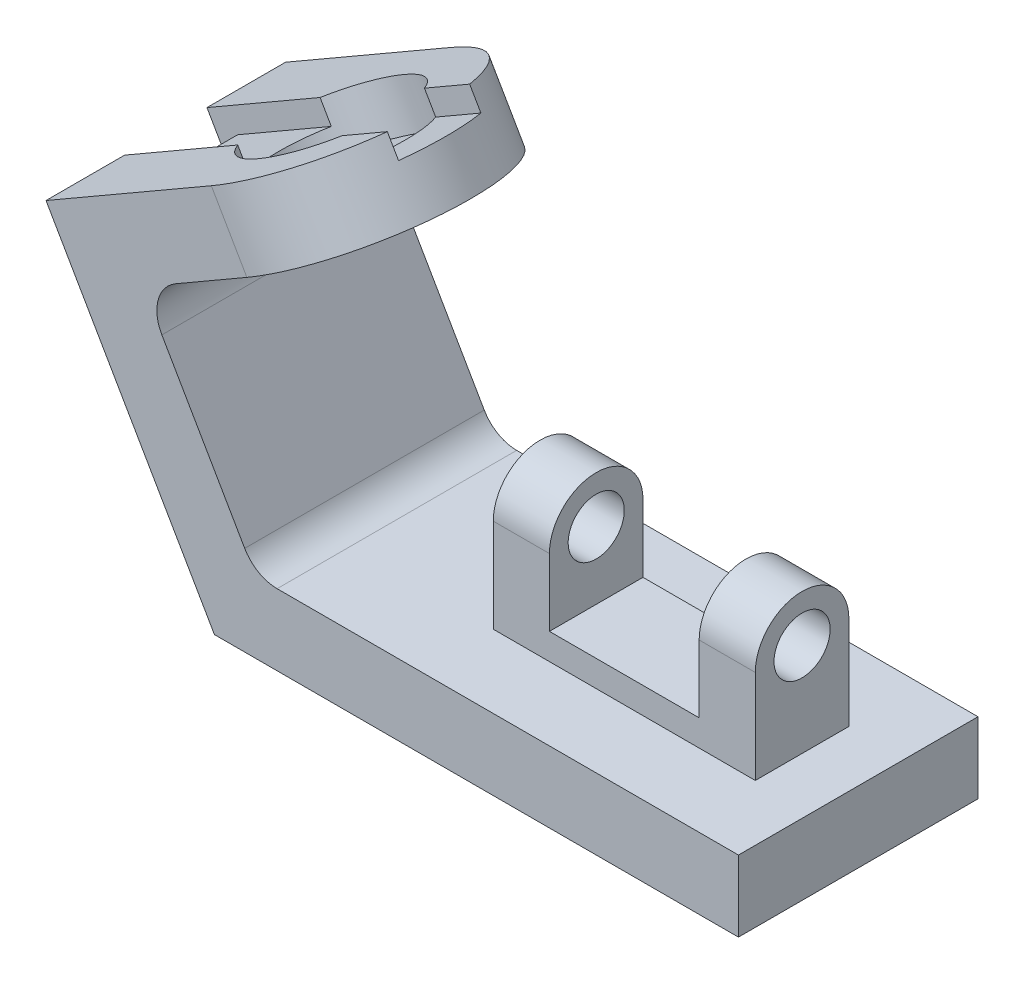
ISO-10303-21;
HEADER;
FILE_DESCRIPTION(('STEP AP214'),'2;1');
FILE_NAME('part.step','',(''),(''),'','','');
FILE_SCHEMA(('AUTOMOTIVE_DESIGN { 1 0 10303 214 1 1 1 1 }'));
ENDSEC;
DATA;
#1=APPLICATION_CONTEXT('core data for automotive mechanical design processes');
#2=APPLICATION_PROTOCOL_DEFINITION('international standard','automotive_design',2000,#1);
#3=PRODUCT_CONTEXT('',#1,'mechanical');
#4=PRODUCT('Part','Part','',(#3));
#5=PRODUCT_RELATED_PRODUCT_CATEGORY('part','',(#4));
#6=PRODUCT_DEFINITION_FORMATION('','',#4);
#7=PRODUCT_DEFINITION_CONTEXT('part definition',#1,'design');
#8=PRODUCT_DEFINITION('design','',#6,#7);
#9=PRODUCT_DEFINITION_SHAPE('','',#8);
#10=(LENGTH_UNIT() NAMED_UNIT(*) SI_UNIT(.MILLI.,.METRE.));
#11=(NAMED_UNIT(*) PLANE_ANGLE_UNIT() SI_UNIT($,.RADIAN.));
#12=(NAMED_UNIT(*) SI_UNIT($,.STERADIAN.) SOLID_ANGLE_UNIT());
#13=UNCERTAINTY_MEASURE_WITH_UNIT(LENGTH_MEASURE(1.E-05),#10,'distance_accuracy_value','');
#14=(GEOMETRIC_REPRESENTATION_CONTEXT(3) GLOBAL_UNCERTAINTY_ASSIGNED_CONTEXT((#13)) GLOBAL_UNIT_ASSIGNED_CONTEXT((#10,
#11,#12)) REPRESENTATION_CONTEXT('',''));
#15=CARTESIAN_POINT('',(0.,0.,0.));
#16=DIRECTION('',(0.,0.,1.));
#17=DIRECTION('',(1.,0.,0.));
#18=AXIS2_PLACEMENT_3D('',#15,#16,#17);
#19=CARTESIAN_POINT('',(55.,44.,-32.));
#20=DIRECTION('',(1.,0.,0.));
#21=DIRECTION('',(0.,0.,-1.));
#22=AXIS2_PLACEMENT_3D('',#19,#20,#21);
#23=CYLINDRICAL_SURFACE('',#22,12.5);
#24=CARTESIAN_POINT('',(70.,44.,-32.));
#25=DIRECTION('',(-1.,0.,0.));
#26=DIRECTION('',(0.,0.,1.));
#27=AXIS2_PLACEMENT_3D('',#24,#25,#26);
#28=CIRCLE('',#27,12.5);
#29=CARTESIAN_POINT('',(70.,44.,-44.5));
#30=VERTEX_POINT('',#29);
#31=CARTESIAN_POINT('',(70.,44.,-19.5));
#32=VERTEX_POINT('',#31);
#33=EDGE_CURVE('E235',#30,#32,#28,.F.);
#34=ORIENTED_EDGE('',*,*,#33,.F.);
#35=DIRECTION('',(1.,0.,0.));
#36=VECTOR('',#35,1.);
#37=CARTESIAN_POINT('',(55.,44.,-44.5));
#38=LINE('',#37,#36);
#39=CARTESIAN_POINT('',(55.,44.,-44.5));
#40=VERTEX_POINT('',#39);
#41=EDGE_CURVE('E309',#40,#30,#38,.T.);
#42=ORIENTED_EDGE('',*,*,#41,.F.);
#43=CARTESIAN_POINT('',(55.,44.,-32.));
#44=DIRECTION('',(1.,0.,0.));
#45=DIRECTION('',(0.,0.,1.));
#46=AXIS2_PLACEMENT_3D('',#43,#44,#45);
#47=CIRCLE('',#46,12.5);
#48=CARTESIAN_POINT('',(55.,44.,-19.5));
#49=VERTEX_POINT('',#48);
#50=EDGE_CURVE('E278',#40,#49,#47,.T.);
#51=ORIENTED_EDGE('',*,*,#50,.T.);
#52=DIRECTION('',(1.,0.,0.));
#53=VECTOR('',#52,1.);
#54=CARTESIAN_POINT('',(55.,44.,-19.5));
#55=LINE('',#54,#53);
#56=EDGE_CURVE('E305',#49,#32,#55,.T.);
#57=ORIENTED_EDGE('',*,*,#56,.T.);
#58=EDGE_LOOP('',(#34,#42,#51,#57));
#59=FACE_BOUND('',#58,.T.);
#60=ADVANCED_FACE('F43',(#59),#23,.T.);
#61=CARTESIAN_POINT('',(2.16729559300655,98.2461339178928,-32.));
#62=DIRECTION('',(-0.499999999999998,0.86602540378444,0.));
#63=DIRECTION('',(-0.86602540378444,-0.499999999999998,0.));
#64=AXIS2_PLACEMENT_3D('',#61,#62,#63);
#65=PLANE('',#64);
#66=DIRECTION('',(-0.86602540378444,-0.499999999999998,0.));
#67=VECTOR('',#66,1.);
#68=CARTESIAN_POINT('',(-41.9999999999999,72.746133917893,-43.));
#69=LINE('',#68,#67);
#70=CARTESIAN_POINT('',(-11.7767891743778,90.1955128238406,-43.));
#71=VERTEX_POINT('',#70);
#72=CARTESIAN_POINT('',(-36.8038475772932,75.7461339178929,-43.));
#73=VERTEX_POINT('',#72);
#74=EDGE_CURVE('E367',#71,#73,#69,.T.);
#75=ORIENTED_EDGE('',*,*,#74,.T.);
#76=DIRECTION('',(0.,0.,1.));
#77=VECTOR('',#76,1.);
#78=CARTESIAN_POINT('',(-36.8038475772932,75.7461339178929,-32.));
#79=LINE('',#78,#77);
#80=CARTESIAN_POINT('',(-36.8038475772932,75.7461339178929,-21.));
#81=VERTEX_POINT('',#80);
#82=EDGE_CURVE('E335',#73,#81,#79,.T.);
#83=ORIENTED_EDGE('',*,*,#82,.T.);
#84=DIRECTION('',(0.86602540378444,0.499999999999998,0.));
#85=VECTOR('',#84,1.);
#86=CARTESIAN_POINT('',(-41.9999999999999,72.746133917893,-21.));
#87=LINE('',#86,#85);
#88=CARTESIAN_POINT('',(-11.7767891743778,90.1955128238406,-21.));
#89=VERTEX_POINT('',#88);
#90=EDGE_CURVE('E374',#81,#89,#87,.T.);
#91=ORIENTED_EDGE('',*,*,#90,.T.);
#92=CARTESIAN_POINT('',(2.16729559300654,98.2461339178928,-32.));
#93=DIRECTION('',(-0.499999999999998,0.86602540378444,0.));
#94=DIRECTION('',(-0.86602540378444,-0.499999999999998,0.));
#95=AXIS2_PLACEMENT_3D('',#92,#93,#94);
#96=CIRCLE('',#95,19.5);
#97=EDGE_CURVE('E354',#71,#89,#96,.T.);
#98=ORIENTED_EDGE('',*,*,#97,.F.);
#99=EDGE_LOOP('',(#75,#83,#91,#98));
#100=FACE_BOUND('',#99,.T.);
#101=ADVANCED_FACE('F613',(#100),#65,.T.);
#102=CARTESIAN_POINT('',(79.167978605708,-35.1229612776126,-32.));
#103=DIRECTION('',(-0.499999999999998,0.86602540378444,0.));
#104=DIRECTION('',(-0.86602540378444,-0.499999999999998,0.));
#105=AXIS2_PLACEMENT_3D('',#102,#103,#104);
#106=CYLINDRICAL_SURFACE('',#105,9.5);
#107=CARTESIAN_POINT('',(8.66729559300654,86.9878036686951,-32.));
#108=DIRECTION('',(0.499999999999998,-0.86602540378444,0.));
#109=DIRECTION('',(0.86602540378444,0.499999999999998,0.));
#110=AXIS2_PLACEMENT_3D('',#107,#108,#109);
#111=CIRCLE('',#110,9.5);
#112=CARTESIAN_POINT('',(16.8945369289587,91.7378036686951,-32.));
#113=VERTEX_POINT('',#112);
#114=EDGE_CURVE('E390',#113,#113,#111,.F.);
#115=ORIENTED_EDGE('',*,*,#114,.F.);
#116=EDGE_LOOP('',(#115));
#117=FACE_BOUND('',#116,.T.);
#118=CARTESIAN_POINT('',(5.16729559300652,93.0499814951862,-32.));
#119=DIRECTION('',(-0.499999999999998,0.86602540378444,0.));
#120=DIRECTION('',(-0.86602540378444,-0.499999999999998,0.));
#121=AXIS2_PLACEMENT_3D('',#118,#119,#120);
#122=CIRCLE('',#121,9.5);
#123=CARTESIAN_POINT('',(-3.05994574294566,88.2999814951863,-32.));
#124=VERTEX_POINT('',#123);
#125=EDGE_CURVE('E362',#124,#124,#122,.F.);
#126=ORIENTED_EDGE('',*,*,#125,.F.);
#127=EDGE_LOOP('',(#126));
#128=FACE_BOUND('',#127,.T.);
#129=ADVANCED_FACE('F618',(#117,#128),#106,.F.);
#130=CARTESIAN_POINT('',(16.1113803603909,106.296755011945,-21.));
#131=VERTEX_POINT('',#130);
#132=CARTESIAN_POINT('',(16.1113803603909,106.296755011945,-43.));
#133=VERTEX_POINT('',#132);
#134=EDGE_CURVE('E347',#131,#133,#96,.T.);
#135=ORIENTED_EDGE('',*,*,#134,.F.);
#136=CARTESIAN_POINT('',(28.1913229523528,113.27111311921,-21.));
#137=VERTEX_POINT('',#136);
#138=EDGE_CURVE('E373',#131,#137,#87,.T.);
#139=ORIENTED_EDGE('',*,*,#138,.T.);
#140=CARTESIAN_POINT('',(2.16729559300655,98.2461339178928,-32.));
#141=DIRECTION('',(-0.499999999999998,0.86602540378444,0.));
#142=DIRECTION('',(-0.86602540378444,-0.499999999999998,0.));
#143=AXIS2_PLACEMENT_3D('',#140,#141,#142);
#144=CIRCLE('',#143,32.);
#145=CARTESIAN_POINT('',(28.1913229523528,113.27111311921,-43.));
#146=VERTEX_POINT('',#145);
#147=EDGE_CURVE('E363',#137,#146,#144,.T.);
#148=ORIENTED_EDGE('',*,*,#147,.T.);
#149=EDGE_CURVE('E369',#146,#133,#69,.T.);
#150=ORIENTED_EDGE('',*,*,#149,.T.);
#151=EDGE_LOOP('',(#135,#139,#148,#150));
#152=FACE_BOUND('',#151,.T.);
#153=ADVANCED_FACE('F621',(#152),#65,.T.);
#154=CARTESIAN_POINT('',(-41.9999999999999,72.746133917893,-21.));
#155=DIRECTION('',(0.,0.,1.));
#156=DIRECTION('',(1.,0.,0.));
#157=AXIS2_PLACEMENT_3D('',#154,#155,#156);
#158=PLANE('',#157);
#159=ORIENTED_EDGE('',*,*,#138,.F.);
#160=DIRECTION('',(-0.499999999999998,0.86602540378444,0.));
#161=VECTOR('',#160,1.);
#162=CARTESIAN_POINT('',(19.1113803603909,101.100602589238,-21.));
#163=LINE('',#162,#161);
#164=CARTESIAN_POINT('',(13.1113803603909,111.492907434652,-21.));
#165=VERTEX_POINT('',#164);
#166=EDGE_CURVE('E353',#131,#165,#163,.T.);
#167=ORIENTED_EDGE('',*,*,#166,.T.);
#168=DIRECTION('',(0.86602540378444,0.499999999999998,0.));
#169=VECTOR('',#168,1.);
#170=CARTESIAN_POINT('',(-44.9999999999998,77.9422863405996,-21.));
#171=LINE('',#170,#169);
#172=CARTESIAN_POINT('',(25.1913229523528,118.467265541916,-21.));
#173=VERTEX_POINT('',#172);
#174=EDGE_CURVE('E382',#165,#173,#171,.T.);
#175=ORIENTED_EDGE('',*,*,#174,.T.);
#176=DIRECTION('',(-0.499999999999998,0.86602540378444,0.));
#177=VECTOR('',#176,1.);
#178=CARTESIAN_POINT('',(28.1913229523528,113.27111311921,-21.));
#179=LINE('',#178,#177);
#180=EDGE_CURVE('E386',#137,#173,#179,.T.);
#181=ORIENTED_EDGE('',*,*,#180,.F.);
#182=EDGE_LOOP('',(#159,#167,#175,#181));
#183=FACE_BOUND('',#182,.T.);
#184=ADVANCED_FACE('F716',(#183),#158,.F.);
#185=CARTESIAN_POINT('',(-41.9999999999999,72.746133917893,-43.));
#186=DIRECTION('',(0.,0.,-1.));
#187=DIRECTION('',(-1.,0.,0.));
#188=AXIS2_PLACEMENT_3D('',#185,#186,#187);
#189=PLANE('',#188);
#190=DIRECTION('',(-0.499999999999998,0.86602540378444,0.));
#191=VECTOR('',#190,1.);
#192=CARTESIAN_POINT('',(-41.9999999999999,72.746133917893,-43.));
#193=LINE('',#192,#191);
#194=CARTESIAN_POINT('',(-17.,29.444863728671,-43.));
#195=VERTEX_POINT('',#194);
#196=CARTESIAN_POINT('',(-44.9999999999998,77.9422863405996,-43.));
#197=VERTEX_POINT('',#196);
#198=EDGE_CURVE('E394',#195,#197,#193,.T.);
#199=ORIENTED_EDGE('',*,*,#198,.F.);
#200=DIRECTION('',(-0.86602540378444,-0.499999999999998,0.));
#201=VECTOR('',#200,1.);
#202=CARTESIAN_POINT('',(-11.8038475772933,32.444863728671,-43.));
#203=LINE('',#202,#201);
#204=CARTESIAN_POINT('',(-11.8038475772933,32.444863728671,-43.));
#205=VERTEX_POINT('',#204);
#206=EDGE_CURVE('E327',#205,#195,#203,.T.);
#207=ORIENTED_EDGE('',*,*,#206,.F.);
#208=DIRECTION('',(0.499999999999998,-0.86602540378444,0.));
#209=VECTOR('',#208,1.);
#210=CARTESIAN_POINT('',(-39.8038475772932,80.9422863405996,-43.));
#211=LINE('',#210,#209);
#212=EDGE_CURVE('E320',#73,#205,#211,.T.);
#213=ORIENTED_EDGE('',*,*,#212,.F.);
#214=ORIENTED_EDGE('',*,*,#74,.F.);
#215=DIRECTION('',(-0.499999999999998,0.86602540378444,0.));
#216=VECTOR('',#215,1.);
#217=CARTESIAN_POINT('',(-8.77678917437782,84.9993604011339,-43.));
#218=LINE('',#217,#216);
#219=CARTESIAN_POINT('',(-14.7767891743778,95.3916652465472,-43.));
#220=VERTEX_POINT('',#219);
#221=EDGE_CURVE('E491',#71,#220,#218,.T.);
#222=ORIENTED_EDGE('',*,*,#221,.T.);
#223=DIRECTION('',(-0.86602540378444,-0.499999999999998,0.));
#224=VECTOR('',#223,1.);
#225=CARTESIAN_POINT('',(-44.9999999999998,77.9422863405996,-43.));
#226=LINE('',#225,#224);
#227=EDGE_CURVE('E383',#220,#197,#226,.T.);
#228=ORIENTED_EDGE('',*,*,#227,.T.);
#229=EDGE_LOOP('',(#199,#207,#213,#214,#222,#228));
#230=FACE_BOUND('',#229,.T.);
#231=ADVANCED_FACE('F713',(#230),#189,.F.);
#232=CARTESIAN_POINT('',(-44.9999999999998,77.9422863405996,-64.));
#233=DIRECTION('',(-0.499999999999998,0.86602540378444,0.));
#234=DIRECTION('',(-0.86602540378444,-0.499999999999998,0.));
#235=AXIS2_PLACEMENT_3D('',#232,#233,#234);
#236=PLANE('',#235);
#237=CARTESIAN_POINT('',(-0.832704406993449,103.442286340599,-32.));
#238=DIRECTION('',(-0.499999999999998,0.86602540378444,0.));
#239=DIRECTION('',(-0.86602540378444,-0.499999999999998,0.));
#240=AXIS2_PLACEMENT_3D('',#237,#238,#239);
#241=CIRCLE('',#240,19.5);
#242=CARTESIAN_POINT('',(-14.7767891743778,95.3916652465472,-21.));
#243=VERTEX_POINT('',#242);
#244=EDGE_CURVE('E348',#243,#165,#241,.T.);
#245=ORIENTED_EDGE('',*,*,#244,.F.);
#246=CARTESIAN_POINT('',(-44.9999999999998,77.9422863405996,-21.));
#247=VERTEX_POINT('',#246);
#248=EDGE_CURVE('E368',#247,#243,#171,.T.);
#249=ORIENTED_EDGE('',*,*,#248,.F.);
#250=DIRECTION('',(0.,0.,1.));
#251=VECTOR('',#250,1.);
#252=CARTESIAN_POINT('',(-44.9999999999998,77.9422863405996,-64.));
#253=LINE('',#252,#251);
#254=CARTESIAN_POINT('',(-44.9999999999998,77.9422863405996,0.));
#255=VERTEX_POINT('',#254);
#256=EDGE_CURVE('E482',#247,#255,#253,.T.);
#257=ORIENTED_EDGE('',*,*,#256,.T.);
#258=DIRECTION('',(-0.86602540378444,-0.499999999999998,0.));
#259=VECTOR('',#258,1.);
#260=CARTESIAN_POINT('',(-44.9999999999998,77.9422863405996,0.));
#261=LINE('',#260,#259);
#262=CARTESIAN_POINT('',(-0.832704406993401,103.442286340599,0.));
#263=VERTEX_POINT('',#262);
#264=EDGE_CURVE('E467',#263,#255,#261,.T.);
#265=ORIENTED_EDGE('',*,*,#264,.F.);
#266=CARTESIAN_POINT('',(-0.832704406993429,103.442286340599,-32.));
#267=DIRECTION('',(-0.499999999999998,0.86602540378444,0.));
#268=DIRECTION('',(0.86602540378444,0.499999999999998,0.));
#269=AXIS2_PLACEMENT_3D('',#266,#267,#268);
#270=CIRCLE('',#269,32.);
#271=EDGE_CURVE('E409',#263,#173,#270,.T.);
#272=ORIENTED_EDGE('',*,*,#271,.T.);
#273=ORIENTED_EDGE('',*,*,#174,.F.);
#274=EDGE_LOOP('',(#245,#249,#257,#265,#272,#273));
#275=FACE_BOUND('',#274,.T.);
#276=ADVANCED_FACE('F684',(#275),#236,.T.);
#277=CARTESIAN_POINT('',(140.,0.,-64.));
#278=DIRECTION('',(0.,-1.,0.));
#279=DIRECTION('',(0.,0.,-1.));
#280=AXIS2_PLACEMENT_3D('',#277,#278,#279);
#281=PLANE('',#280);
#282=DIRECTION('',(1.,0.,0.));
#283=VECTOR('',#282,1.);
#284=CARTESIAN_POINT('',(140.,0.,0.));
#285=LINE('',#284,#283);
#286=CARTESIAN_POINT('',(0.,0.,0.));
#287=VERTEX_POINT('',#286);
#288=CARTESIAN_POINT('',(140.,0.,0.));
#289=VERTEX_POINT('',#288);
#290=EDGE_CURVE('E408',#287,#289,#285,.T.);
#291=ORIENTED_EDGE('',*,*,#290,.F.);
#292=DIRECTION('',(0.,0.,1.));
#293=VECTOR('',#292,1.);
#294=CARTESIAN_POINT('',(0.,0.,-64.));
#295=LINE('',#294,#293);
#296=CARTESIAN_POINT('',(0.,0.,-64.));
#297=VERTEX_POINT('',#296);
#298=EDGE_CURVE('E474',#297,#287,#295,.T.);
#299=ORIENTED_EDGE('',*,*,#298,.F.);
#300=DIRECTION('',(1.,0.,0.));
#301=VECTOR('',#300,1.);
#302=CARTESIAN_POINT('',(140.,0.,-64.));
#303=LINE('',#302,#301);
#304=CARTESIAN_POINT('',(140.,0.,-64.));
#305=VERTEX_POINT('',#304);
#306=EDGE_CURVE('E413',#297,#305,#303,.T.);
#307=ORIENTED_EDGE('',*,*,#306,.T.);
#308=DIRECTION('',(0.,0.,1.));
#309=VECTOR('',#308,1.);
#310=CARTESIAN_POINT('',(140.,0.,-64.));
#311=LINE('',#310,#309);
#312=EDGE_CURVE('E444',#305,#289,#311,.T.);
#313=ORIENTED_EDGE('',*,*,#312,.T.);
#314=EDGE_LOOP('',(#291,#299,#307,#313));
#315=FACE_BOUND('',#314,.T.);
#316=ADVANCED_FACE('F549',(#315),#281,.T.);
#317=CARTESIAN_POINT('',(0.,0.,-64.));
#318=DIRECTION('',(-0.86602540378444,-0.499999999999998,0.));
#319=DIRECTION('',(0.499999999999998,-0.86602540378444,0.));
#320=AXIS2_PLACEMENT_3D('',#317,#318,#319);
#321=PLANE('',#320);
#322=DIRECTION('',(-0.499999999999998,0.86602540378444,0.));
#323=VECTOR('',#322,1.);
#324=CARTESIAN_POINT('',(-41.9999999999999,72.746133917893,-21.));
#325=LINE('',#324,#323);
#326=CARTESIAN_POINT('',(-17.,29.444863728671,-21.));
#327=VERTEX_POINT('',#326);
#328=EDGE_CURVE('E391',#327,#247,#325,.T.);
#329=ORIENTED_EDGE('',*,*,#328,.F.);
#330=DIRECTION('',(0.,0.,1.));
#331=VECTOR('',#330,1.);
#332=CARTESIAN_POINT('',(-17.,29.444863728671,-43.));
#333=LINE('',#332,#331);
#334=EDGE_CURVE('E304',#195,#327,#333,.T.);
#335=ORIENTED_EDGE('',*,*,#334,.F.);
#336=ORIENTED_EDGE('',*,*,#198,.T.);
#337=CARTESIAN_POINT('',(-44.9999999999998,77.9422863405996,-64.));
#338=VERTEX_POINT('',#337);
#339=EDGE_CURVE('E478',#338,#197,#253,.T.);
#340=ORIENTED_EDGE('',*,*,#339,.F.);
#341=DIRECTION('',(0.499999999999998,-0.86602540378444,0.));
#342=VECTOR('',#341,1.);
#343=CARTESIAN_POINT('',(0.,0.,-64.));
#344=LINE('',#343,#342);
#345=EDGE_CURVE('E440',#338,#297,#344,.T.);
#346=ORIENTED_EDGE('',*,*,#345,.T.);
#347=ORIENTED_EDGE('',*,*,#298,.T.);
#348=DIRECTION('',(0.499999999999998,-0.86602540378444,0.));
#349=VECTOR('',#348,1.);
#350=CARTESIAN_POINT('',(0.,0.,0.));
#351=LINE('',#350,#349);
#352=EDGE_CURVE('E418',#255,#287,#351,.T.);
#353=ORIENTED_EDGE('',*,*,#352,.F.);
#354=ORIENTED_EDGE('',*,*,#256,.F.);
#355=EDGE_LOOP('',(#329,#335,#336,#340,#346,#347,#353,#354));
#356=FACE_BOUND('',#355,.T.);
#357=ADVANCED_FACE('F553',(#356),#321,.T.);
#358=CARTESIAN_POINT('',(13.1113803603909,111.492907434652,-43.));
#359=VERTEX_POINT('',#358);
#360=EDGE_CURVE('E342',#359,#220,#241,.T.);
#361=ORIENTED_EDGE('',*,*,#360,.F.);
#362=CARTESIAN_POINT('',(25.1913229523528,118.467265541916,-43.));
#363=VERTEX_POINT('',#362);
#364=EDGE_CURVE('E378',#363,#359,#226,.T.);
#365=ORIENTED_EDGE('',*,*,#364,.F.);
#366=CARTESIAN_POINT('',(-0.832704406993429,103.442286340599,-64.));
#367=VERTEX_POINT('',#366);
#368=EDGE_CURVE('E403',#363,#367,#270,.T.);
#369=ORIENTED_EDGE('',*,*,#368,.T.);
#370=DIRECTION('',(-0.86602540378444,-0.499999999999998,0.));
#371=VECTOR('',#370,1.);
#372=CARTESIAN_POINT('',(-44.9999999999998,77.9422863405996,-64.));
#373=LINE('',#372,#371);
#374=EDGE_CURVE('E436',#367,#338,#373,.T.);
#375=ORIENTED_EDGE('',*,*,#374,.T.);
#376=ORIENTED_EDGE('',*,*,#339,.T.);
#377=ORIENTED_EDGE('',*,*,#227,.F.);
#378=EDGE_LOOP('',(#361,#365,#369,#375,#376,#377));
#379=FACE_BOUND('',#378,.T.);
#380=ADVANCED_FACE('F559',(#379),#236,.T.);
#381=CARTESIAN_POINT('',(8.66729559300655,86.9878036686951,-64.));
#382=DIRECTION('',(0.499999999999998,-0.86602540378444,0.));
#383=DIRECTION('',(0.86602540378444,0.499999999999998,0.));
#384=AXIS2_PLACEMENT_3D('',#381,#382,#383);
#385=PLANE('',#384);
#386=ORIENTED_EDGE('',*,*,#114,.T.);
#387=EDGE_LOOP('',(#386));
#388=FACE_BOUND('',#387,.T.);
#389=DIRECTION('',(0.86602540378444,0.499999999999998,0.));
#390=VECTOR('',#389,1.);
#391=CARTESIAN_POINT('',(8.66729559300655,86.9878036686951,0.));
#392=LINE('',#391,#390);
#393=CARTESIAN_POINT('',(-10.3852632902511,75.9878036686952,0.));
#394=VERTEX_POINT('',#393);
#395=CARTESIAN_POINT('',(8.66729559300654,86.9878036686952,0.));
#396=VERTEX_POINT('',#395);
#397=EDGE_CURVE('E460',#394,#396,#392,.T.);
#398=ORIENTED_EDGE('',*,*,#397,.F.);
#399=DIRECTION('',(0.,0.,1.));
#400=VECTOR('',#399,1.);
#401=CARTESIAN_POINT('',(-10.3852632902511,75.9878036686952,-64.));
#402=LINE('',#401,#400);
#403=CARTESIAN_POINT('',(-10.3852632902511,75.9878036686952,-64.));
#404=VERTEX_POINT('',#403);
#405=EDGE_CURVE('E520',#394,#404,#402,.F.);
#406=ORIENTED_EDGE('',*,*,#405,.T.);
#407=DIRECTION('',(0.86602540378444,0.499999999999998,0.));
#408=VECTOR('',#407,1.);
#409=CARTESIAN_POINT('',(8.66729559300655,86.9878036686951,-64.));
#410=LINE('',#409,#408);
#411=CARTESIAN_POINT('',(8.66729559300653,86.9878036686951,-64.));
#412=VERTEX_POINT('',#411);
#413=EDGE_CURVE('E429',#404,#412,#410,.T.);
#414=ORIENTED_EDGE('',*,*,#413,.T.);
#415=CARTESIAN_POINT('',(8.66729559300653,86.9878036686951,-32.));
#416=DIRECTION('',(-0.499999999999998,0.86602540378444,0.));
#417=DIRECTION('',(0.86602540378444,0.499999999999998,0.));
#418=AXIS2_PLACEMENT_3D('',#415,#416,#417);
#419=CIRCLE('',#418,32.);
#420=EDGE_CURVE('E404',#396,#412,#419,.T.);
#421=ORIENTED_EDGE('',*,*,#420,.F.);
#422=EDGE_LOOP('',(#398,#406,#414,#421));
#423=FACE_BOUND('',#422,.T.);
#424=ADVANCED_FACE('F572',(#388,#423),#385,.T.);
#425=CARTESIAN_POINT('',(-19.0455173280955,70.9878036686952,-64.));
#426=DIRECTION('',(0.86602540378444,0.499999999999998,0.));
#427=DIRECTION('',(-0.499999999999998,0.86602540378444,0.));
#428=AXIS2_PLACEMENT_3D('',#425,#426,#427);
#429=PLANE('',#428);
#430=DIRECTION('',(-0.499999999999998,0.86602540378444,0.));
#431=VECTOR('',#430,1.);
#432=CARTESIAN_POINT('',(-19.0455173280955,70.9878036686952,-64.));
#433=LINE('',#432,#431);
#434=CARTESIAN_POINT('',(8.08290376865481,24.,-64.));
#435=VERTEX_POINT('',#434);
#436=CARTESIAN_POINT('',(-14.0455173280955,62.3275496308508,-64.));
#437=VERTEX_POINT('',#436);
#438=EDGE_CURVE('E425',#435,#437,#433,.T.);
#439=ORIENTED_EDGE('',*,*,#438,.T.);
#440=DIRECTION('',(0.,0.,1.));
#441=VECTOR('',#440,1.);
#442=CARTESIAN_POINT('',(-14.0455173280955,62.3275496308508,0.));
#443=LINE('',#442,#441);
#444=CARTESIAN_POINT('',(-14.0455173280955,62.3275496308508,0.));
#445=VERTEX_POINT('',#444);
#446=EDGE_CURVE('E516',#437,#445,#443,.T.);
#447=ORIENTED_EDGE('',*,*,#446,.T.);
#448=DIRECTION('',(-0.499999999999998,0.86602540378444,0.));
#449=VECTOR('',#448,1.);
#450=CARTESIAN_POINT('',(-19.0455173280955,70.9878036686952,0.));
#451=LINE('',#450,#449);
#452=CARTESIAN_POINT('',(8.08290376865481,24.,0.));
#453=VERTEX_POINT('',#452);
#454=EDGE_CURVE('E456',#453,#445,#451,.T.);
#455=ORIENTED_EDGE('',*,*,#454,.F.);
#456=DIRECTION('',(0.,0.,1.));
#457=VECTOR('',#456,1.);
#458=CARTESIAN_POINT('',(8.08290376865481,24.,-64.));
#459=LINE('',#458,#457);
#460=EDGE_CURVE('E507',#453,#435,#459,.F.);
#461=ORIENTED_EDGE('',*,*,#460,.T.);
#462=EDGE_LOOP('',(#439,#447,#455,#461));
#463=FACE_BOUND('',#462,.T.);
#464=ADVANCED_FACE('F537',(#463),#429,.T.);
#465=CARTESIAN_POINT('',(10.9696551146029,19.,-64.));
#466=DIRECTION('',(0.,1.,0.));
#467=DIRECTION('',(0.,0.,1.));
#468=AXIS2_PLACEMENT_3D('',#465,#466,#467);
#469=PLANE('',#468);
#470=DIRECTION('',(0.,0.,-1.));
#471=VECTOR('',#470,1.);
#472=CARTESIAN_POINT('',(55.,19.,-44.5));
#473=LINE('',#472,#471);
#474=CARTESIAN_POINT('',(55.,19.,-19.5));
#475=VERTEX_POINT('',#474);
#476=CARTESIAN_POINT('',(55.,19.,-44.5));
#477=VERTEX_POINT('',#476);
#478=EDGE_CURVE('E269',#475,#477,#473,.T.);
#479=ORIENTED_EDGE('',*,*,#478,.T.);
#480=DIRECTION('',(1.,0.,0.));
#481=VECTOR('',#480,1.);
#482=CARTESIAN_POINT('',(55.,19.,-44.5));
#483=LINE('',#482,#481);
#484=CARTESIAN_POINT('',(125.,19.,-44.5));
#485=VERTEX_POINT('',#484);
#486=EDGE_CURVE('E286',#477,#485,#483,.T.);
#487=ORIENTED_EDGE('',*,*,#486,.T.);
#488=DIRECTION('',(0.,0.,-1.));
#489=VECTOR('',#488,1.);
#490=CARTESIAN_POINT('',(125.,19.,-44.5));
#491=LINE('',#490,#489);
#492=CARTESIAN_POINT('',(125.,19.,-19.5));
#493=VERTEX_POINT('',#492);
#494=EDGE_CURVE('E268',#493,#485,#491,.T.);
#495=ORIENTED_EDGE('',*,*,#494,.F.);
#496=DIRECTION('',(1.,0.,0.));
#497=VECTOR('',#496,1.);
#498=CARTESIAN_POINT('',(55.,19.,-19.5));
#499=LINE('',#498,#497);
#500=EDGE_CURVE('E300',#475,#493,#499,.T.);
#501=ORIENTED_EDGE('',*,*,#500,.F.);
#502=EDGE_LOOP('',(#479,#487,#495,#501));
#503=FACE_BOUND('',#502,.T.);
#504=DIRECTION('',(-1.,0.,0.));
#505=VECTOR('',#504,1.);
#506=CARTESIAN_POINT('',(10.9696551146029,19.,-64.));
#507=LINE('',#506,#505);
#508=CARTESIAN_POINT('',(140.,19.,-64.));
#509=VERTEX_POINT('',#508);
#510=CARTESIAN_POINT('',(16.7431578064992,19.,-64.));
#511=VERTEX_POINT('',#510);
#512=EDGE_CURVE('E422',#509,#511,#507,.T.);
#513=ORIENTED_EDGE('',*,*,#512,.T.);
#514=DIRECTION('',(0.,0.,1.));
#515=VECTOR('',#514,1.);
#516=CARTESIAN_POINT('',(16.7431578064992,19.,0.));
#517=LINE('',#516,#515);
#518=CARTESIAN_POINT('',(16.7431578064992,19.,0.));
#519=VERTEX_POINT('',#518);
#520=EDGE_CURVE('E523',#511,#519,#517,.T.);
#521=ORIENTED_EDGE('',*,*,#520,.T.);
#522=DIRECTION('',(-1.,0.,0.));
#523=VECTOR('',#522,1.);
#524=CARTESIAN_POINT('',(10.9696551146029,19.,0.));
#525=LINE('',#524,#523);
#526=CARTESIAN_POINT('',(140.,19.,0.));
#527=VERTEX_POINT('',#526);
#528=EDGE_CURVE('E452',#527,#519,#525,.T.);
#529=ORIENTED_EDGE('',*,*,#528,.F.);
#530=DIRECTION('',(0.,0.,1.));
#531=VECTOR('',#530,1.);
#532=CARTESIAN_POINT('',(140.,19.,-64.));
#533=LINE('',#532,#531);
#534=EDGE_CURVE('E483',#509,#527,#533,.T.);
#535=ORIENTED_EDGE('',*,*,#534,.F.);
#536=EDGE_LOOP('',(#513,#521,#529,#535));
#537=FACE_BOUND('',#536,.T.);
#538=ADVANCED_FACE('F540',(#503,#537),#469,.T.);
#539=CARTESIAN_POINT('',(140.,19.,-64.));
#540=DIRECTION('',(1.,0.,0.));
#541=DIRECTION('',(0.,0.,-1.));
#542=AXIS2_PLACEMENT_3D('',#539,#540,#541);
#543=PLANE('',#542);
#544=DIRECTION('',(0.,1.,0.));
#545=VECTOR('',#544,1.);
#546=CARTESIAN_POINT('',(140.,19.,0.));
#547=LINE('',#546,#545);
#548=EDGE_CURVE('E448',#289,#527,#547,.T.);
#549=ORIENTED_EDGE('',*,*,#548,.F.);
#550=ORIENTED_EDGE('',*,*,#312,.F.);
#551=DIRECTION('',(0.,1.,0.));
#552=VECTOR('',#551,1.);
#553=CARTESIAN_POINT('',(140.,19.,-64.));
#554=LINE('',#553,#552);
#555=EDGE_CURVE('E417',#305,#509,#554,.T.);
#556=ORIENTED_EDGE('',*,*,#555,.T.);
#557=ORIENTED_EDGE('',*,*,#534,.T.);
#558=EDGE_LOOP('',(#549,#550,#556,#557));
#559=FACE_BOUND('',#558,.T.);
#560=ADVANCED_FACE('F546',(#559),#543,.T.);
#561=CARTESIAN_POINT('',(0.,0.,-64.));
#562=DIRECTION('',(0.,0.,1.));
#563=DIRECTION('',(1.,0.,0.));
#564=AXIS2_PLACEMENT_3D('',#561,#562,#563);
#565=PLANE('',#564);
#566=ORIENTED_EDGE('',*,*,#306,.F.);
#567=ORIENTED_EDGE('',*,*,#345,.F.);
#568=ORIENTED_EDGE('',*,*,#374,.F.);
#569=DIRECTION('',(-0.499999999999998,0.86602540378444,0.));
#570=VECTOR('',#569,1.);
#571=CARTESIAN_POINT('',(-0.832704406993401,103.442286340599,-64.));
#572=LINE('',#571,#570);
#573=EDGE_CURVE('E432',#412,#367,#572,.T.);
#574=ORIENTED_EDGE('',*,*,#573,.F.);
#575=ORIENTED_EDGE('',*,*,#413,.F.);
#576=CARTESIAN_POINT('',(-5.38526329025112,67.3275496308508,-64.));
#577=DIRECTION('',(0.,0.,1.));
#578=DIRECTION('',(1.,0.,0.));
#579=AXIS2_PLACEMENT_3D('',#576,#577,#578);
#580=CIRCLE('',#579,10.);
#581=EDGE_CURVE('E529',#404,#437,#580,.T.);
#582=ORIENTED_EDGE('',*,*,#581,.T.);
#583=ORIENTED_EDGE('',*,*,#438,.F.);
#584=CARTESIAN_POINT('',(16.7431578064992,29.,-64.));
#585=DIRECTION('',(0.,0.,1.));
#586=DIRECTION('',(1.,0.,0.));
#587=AXIS2_PLACEMENT_3D('',#584,#585,#586);
#588=CIRCLE('',#587,10.);
#589=EDGE_CURVE('E11',#435,#511,#588,.T.);
#590=ORIENTED_EDGE('',*,*,#589,.T.);
#591=ORIENTED_EDGE('',*,*,#512,.F.);
#592=ORIENTED_EDGE('',*,*,#555,.F.);
#593=EDGE_LOOP('',(#566,#567,#568,#574,#575,#582,#583,#590,#591,#592));
#594=FACE_BOUND('',#593,.T.);
#595=ADVANCED_FACE('F543',(#594),#565,.F.);
#596=CARTESIAN_POINT('',(0.,0.,0.));
#597=DIRECTION('',(0.,0.,1.));
#598=DIRECTION('',(1.,0.,0.));
#599=AXIS2_PLACEMENT_3D('',#596,#597,#598);
#600=PLANE('',#599);
#601=ORIENTED_EDGE('',*,*,#290,.T.);
#602=ORIENTED_EDGE('',*,*,#548,.T.);
#603=ORIENTED_EDGE('',*,*,#528,.T.);
#604=CARTESIAN_POINT('',(16.7431578064992,29.,0.));
#605=DIRECTION('',(0.,0.,1.));
#606=DIRECTION('',(1.,0.,0.));
#607=AXIS2_PLACEMENT_3D('',#604,#605,#606);
#608=CIRCLE('',#607,10.);
#609=EDGE_CURVE('E52',#519,#453,#608,.F.);
#610=ORIENTED_EDGE('',*,*,#609,.T.);
#611=ORIENTED_EDGE('',*,*,#454,.T.);
#612=CARTESIAN_POINT('',(-5.38526329025112,67.3275496308508,0.));
#613=DIRECTION('',(0.,0.,1.));
#614=DIRECTION('',(1.,0.,0.));
#615=AXIS2_PLACEMENT_3D('',#612,#613,#614);
#616=CIRCLE('',#615,10.);
#617=EDGE_CURVE('E526',#445,#394,#616,.F.);
#618=ORIENTED_EDGE('',*,*,#617,.T.);
#619=ORIENTED_EDGE('',*,*,#397,.T.);
#620=DIRECTION('',(-0.499999999999998,0.86602540378444,0.));
#621=VECTOR('',#620,1.);
#622=CARTESIAN_POINT('',(-0.832704406993401,103.442286340599,0.));
#623=LINE('',#622,#621);
#624=EDGE_CURVE('E463',#396,#263,#623,.T.);
#625=ORIENTED_EDGE('',*,*,#624,.T.);
#626=ORIENTED_EDGE('',*,*,#264,.T.);
#627=ORIENTED_EDGE('',*,*,#352,.T.);
#628=EDGE_LOOP('',(#601,#602,#603,#610,#611,#618,#619,#625,#626,#627));
#629=FACE_BOUND('',#628,.T.);
#630=ADVANCED_FACE('F534',(#629),#600,.T.);
#631=CARTESIAN_POINT('',(8.66729559300653,86.9878036686951,-32.));
#632=DIRECTION('',(-0.499999999999998,0.86602540378444,0.));
#633=DIRECTION('',(-0.86602540378444,-0.499999999999998,0.));
#634=AXIS2_PLACEMENT_3D('',#631,#632,#633);
#635=CYLINDRICAL_SURFACE('',#634,32.);
#636=ORIENTED_EDGE('',*,*,#180,.T.);
#637=ORIENTED_EDGE('',*,*,#271,.F.);
#638=ORIENTED_EDGE('',*,*,#624,.F.);
#639=ORIENTED_EDGE('',*,*,#420,.T.);
#640=ORIENTED_EDGE('',*,*,#573,.T.);
#641=ORIENTED_EDGE('',*,*,#368,.F.);
#642=DIRECTION('',(-0.499999999999998,0.86602540378444,0.));
#643=VECTOR('',#642,1.);
#644=CARTESIAN_POINT('',(28.1913229523528,113.27111311921,-43.));
#645=LINE('',#644,#643);
#646=EDGE_CURVE('E377',#146,#363,#645,.T.);
#647=ORIENTED_EDGE('',*,*,#646,.F.);
#648=ORIENTED_EDGE('',*,*,#147,.F.);
#649=EDGE_LOOP('',(#636,#637,#638,#639,#640,#641,#647,#648));
#650=FACE_BOUND('',#649,.T.);
#651=ADVANCED_FACE('F566',(#650),#635,.T.);
#652=ORIENTED_EDGE('',*,*,#248,.T.);
#653=DIRECTION('',(-0.499999999999998,0.86602540378444,0.));
#654=VECTOR('',#653,1.);
#655=CARTESIAN_POINT('',(-8.77678917437782,84.9993604011339,-21.));
#656=LINE('',#655,#654);
#657=EDGE_CURVE('E358',#243,#89,#656,.F.);
#658=ORIENTED_EDGE('',*,*,#657,.T.);
#659=ORIENTED_EDGE('',*,*,#90,.F.);
#660=DIRECTION('',(-0.499999999999998,0.86602540378444,0.));
#661=VECTOR('',#660,1.);
#662=CARTESIAN_POINT('',(-39.8038475772932,80.9422863405996,-21.));
#663=LINE('',#662,#661);
#664=CARTESIAN_POINT('',(-11.8038475772933,32.444863728671,-21.));
#665=VERTEX_POINT('',#664);
#666=EDGE_CURVE('E317',#665,#81,#663,.T.);
#667=ORIENTED_EDGE('',*,*,#666,.F.);
#668=DIRECTION('',(-0.86602540378444,-0.499999999999998,0.));
#669=VECTOR('',#668,1.);
#670=CARTESIAN_POINT('',(-11.8038475772933,32.444863728671,-21.));
#671=LINE('',#670,#669);
#672=EDGE_CURVE('E331',#665,#327,#671,.T.);
#673=ORIENTED_EDGE('',*,*,#672,.T.);
#674=ORIENTED_EDGE('',*,*,#328,.T.);
#675=EDGE_LOOP('',(#652,#658,#659,#667,#673,#674));
#676=FACE_BOUND('',#675,.T.);
#677=ADVANCED_FACE('F704',(#676),#158,.F.);
#678=ORIENTED_EDGE('',*,*,#364,.T.);
#679=DIRECTION('',(-0.499999999999998,0.86602540378444,0.));
#680=VECTOR('',#679,1.);
#681=CARTESIAN_POINT('',(19.1113803603909,101.100602589238,-43.));
#682=LINE('',#681,#680);
#683=EDGE_CURVE('E477',#359,#133,#682,.F.);
#684=ORIENTED_EDGE('',*,*,#683,.T.);
#685=ORIENTED_EDGE('',*,*,#149,.F.);
#686=ORIENTED_EDGE('',*,*,#646,.T.);
#687=EDGE_LOOP('',(#678,#684,#685,#686));
#688=FACE_BOUND('',#687,.T.);
#689=ADVANCED_FACE('F708',(#688),#189,.F.);
#690=CARTESIAN_POINT('',(5.16729559300653,93.0499814951862,-32.));
#691=DIRECTION('',(-0.499999999999998,0.86602540378444,0.));
#692=DIRECTION('',(-0.86602540378444,-0.499999999999998,0.));
#693=AXIS2_PLACEMENT_3D('',#690,#691,#692);
#694=PLANE('',#693);
#695=CARTESIAN_POINT('',(5.16729559300653,93.0499814951862,-32.));
#696=DIRECTION('',(-0.499999999999998,0.86602540378444,0.));
#697=DIRECTION('',(-0.86602540378444,-0.499999999999998,0.));
#698=AXIS2_PLACEMENT_3D('',#695,#696,#697);
#699=CIRCLE('',#698,19.5);
#700=CARTESIAN_POINT('',(-11.72019978079,83.2999814951863,-32.));
#701=VERTEX_POINT('',#700);
#702=EDGE_CURVE('E343',#701,#701,#699,.T.);
#703=ORIENTED_EDGE('',*,*,#702,.T.);
#704=EDGE_LOOP('',(#703));
#705=FACE_BOUND('',#704,.T.);
#706=ORIENTED_EDGE('',*,*,#125,.T.);
#707=EDGE_LOOP('',(#706));
#708=FACE_BOUND('',#707,.T.);
#709=ADVANCED_FACE('F711',(#705,#708),#694,.T.);
#710=CARTESIAN_POINT('',(5.16729559300653,93.0499814951862,-32.));
#711=DIRECTION('',(-0.499999999999998,0.86602540378444,0.));
#712=DIRECTION('',(-0.86602540378444,-0.499999999999998,0.));
#713=AXIS2_PLACEMENT_3D('',#710,#711,#712);
#714=CYLINDRICAL_SURFACE('',#713,19.5);
#715=ORIENTED_EDGE('',*,*,#702,.F.);
#716=EDGE_LOOP('',(#715));
#717=FACE_BOUND('',#716,.T.);
#718=ORIENTED_EDGE('',*,*,#244,.T.);
#719=ORIENTED_EDGE('',*,*,#166,.F.);
#720=ORIENTED_EDGE('',*,*,#134,.T.);
#721=ORIENTED_EDGE('',*,*,#683,.F.);
#722=ORIENTED_EDGE('',*,*,#360,.T.);
#723=ORIENTED_EDGE('',*,*,#221,.F.);
#724=ORIENTED_EDGE('',*,*,#97,.T.);
#725=ORIENTED_EDGE('',*,*,#657,.F.);
#726=EDGE_LOOP('',(#718,#719,#720,#721,#722,#723,#724,#725));
#727=FACE_BOUND('',#726,.T.);
#728=ADVANCED_FACE('F718',(#717,#727),#714,.F.);
#729=CARTESIAN_POINT('',(-11.8038475772933,32.444863728671,-43.));
#730=DIRECTION('',(0.499999999999998,-0.86602540378444,0.));
#731=DIRECTION('',(0.86602540378444,0.499999999999998,0.));
#732=AXIS2_PLACEMENT_3D('',#729,#730,#731);
#733=PLANE('',#732);
#734=ORIENTED_EDGE('',*,*,#334,.T.);
#735=ORIENTED_EDGE('',*,*,#672,.F.);
#736=DIRECTION('',(0.,0.,1.));
#737=VECTOR('',#736,1.);
#738=CARTESIAN_POINT('',(-11.8038475772933,32.444863728671,-43.));
#739=LINE('',#738,#737);
#740=EDGE_CURVE('E323',#205,#665,#739,.T.);
#741=ORIENTED_EDGE('',*,*,#740,.F.);
#742=ORIENTED_EDGE('',*,*,#206,.T.);
#743=EDGE_LOOP('',(#734,#735,#741,#742));
#744=FACE_BOUND('',#743,.T.);
#745=ADVANCED_FACE('F633',(#744),#733,.F.);
#746=CARTESIAN_POINT('',(5.19615242270664,2.99999999999999,0.));
#747=DIRECTION('',(-0.86602540378444,-0.499999999999998,0.));
#748=DIRECTION('',(0.499999999999998,-0.86602540378444,0.));
#749=AXIS2_PLACEMENT_3D('',#746,#747,#748);
#750=PLANE('',#749);
#751=ORIENTED_EDGE('',*,*,#212,.T.);
#752=ORIENTED_EDGE('',*,*,#740,.T.);
#753=ORIENTED_EDGE('',*,*,#666,.T.);
#754=ORIENTED_EDGE('',*,*,#82,.F.);
#755=EDGE_LOOP('',(#751,#752,#753,#754));
#756=FACE_BOUND('',#755,.T.);
#757=ADVANCED_FACE('F629',(#756),#750,.T.);
#758=CARTESIAN_POINT('',(55.,19.,-19.5));
#759=DIRECTION('',(0.,0.,1.));
#760=DIRECTION('',(0.,-1.,0.));
#761=AXIS2_PLACEMENT_3D('',#758,#759,#760);
#762=PLANE('',#761);
#763=DIRECTION('',(0.,-1.,0.));
#764=VECTOR('',#763,1.);
#765=CARTESIAN_POINT('',(70.,26.,-19.5));
#766=LINE('',#765,#764);
#767=CARTESIAN_POINT('',(70.,26.,-19.5));
#768=VERTEX_POINT('',#767);
#769=EDGE_CURVE('E229',#32,#768,#766,.T.);
#770=ORIENTED_EDGE('',*,*,#769,.F.);
#771=ORIENTED_EDGE('',*,*,#56,.F.);
#772=DIRECTION('',(0.,-1.,0.));
#773=VECTOR('',#772,1.);
#774=CARTESIAN_POINT('',(55.,19.,-19.5));
#775=LINE('',#774,#773);
#776=EDGE_CURVE('E282',#49,#475,#775,.T.);
#777=ORIENTED_EDGE('',*,*,#776,.T.);
#778=ORIENTED_EDGE('',*,*,#500,.T.);
#779=DIRECTION('',(0.,-1.,0.));
#780=VECTOR('',#779,1.);
#781=CARTESIAN_POINT('',(125.,19.,-19.5));
#782=LINE('',#781,#780);
#783=CARTESIAN_POINT('',(125.,44.,-19.5));
#784=VERTEX_POINT('',#783);
#785=EDGE_CURVE('E274',#784,#493,#782,.T.);
#786=ORIENTED_EDGE('',*,*,#785,.F.);
#787=CARTESIAN_POINT('',(110.,44.,-19.5));
#788=VERTEX_POINT('',#787);
#789=EDGE_CURVE('E308',#788,#784,#55,.T.);
#790=ORIENTED_EDGE('',*,*,#789,.F.);
#791=DIRECTION('',(0.,1.,0.));
#792=VECTOR('',#791,1.);
#793=CARTESIAN_POINT('',(110.,26.,-19.5));
#794=LINE('',#793,#792);
#795=CARTESIAN_POINT('',(110.,26.,-19.5));
#796=VERTEX_POINT('',#795);
#797=EDGE_CURVE('E251',#796,#788,#794,.T.);
#798=ORIENTED_EDGE('',*,*,#797,.F.);
#799=DIRECTION('',(1.,0.,0.));
#800=VECTOR('',#799,1.);
#801=CARTESIAN_POINT('',(70.,26.,-19.5));
#802=LINE('',#801,#800);
#803=EDGE_CURVE('E240',#768,#796,#802,.T.);
#804=ORIENTED_EDGE('',*,*,#803,.F.);
#805=EDGE_LOOP('',(#770,#771,#777,#778,#786,#790,#798,#804));
#806=FACE_BOUND('',#805,.T.);
#807=ADVANCED_FACE('F253',(#806),#762,.T.);
#808=CARTESIAN_POINT('',(110.,44.,-32.));
#809=DIRECTION('',(1.,0.,0.));
#810=DIRECTION('',(0.,0.,-1.));
#811=AXIS2_PLACEMENT_3D('',#808,#809,#810);
#812=CIRCLE('',#811,12.5);
#813=CARTESIAN_POINT('',(110.,44.,-44.5));
#814=VERTEX_POINT('',#813);
#815=EDGE_CURVE('E262',#788,#814,#812,.F.);
#816=ORIENTED_EDGE('',*,*,#815,.F.);
#817=ORIENTED_EDGE('',*,*,#789,.T.);
#818=CARTESIAN_POINT('',(125.,44.,-32.));
#819=DIRECTION('',(1.,0.,0.));
#820=DIRECTION('',(0.,0.,1.));
#821=AXIS2_PLACEMENT_3D('',#818,#819,#820);
#822=CIRCLE('',#821,12.5);
#823=CARTESIAN_POINT('',(125.,44.,-44.5));
#824=VERTEX_POINT('',#823);
#825=EDGE_CURVE('E294',#824,#784,#822,.T.);
#826=ORIENTED_EDGE('',*,*,#825,.F.);
#827=EDGE_CURVE('E313',#814,#824,#38,.T.);
#828=ORIENTED_EDGE('',*,*,#827,.F.);
#829=EDGE_LOOP('',(#816,#817,#826,#828));
#830=FACE_BOUND('',#829,.T.);
#831=ADVANCED_FACE('F599',(#830),#23,.T.);
#832=CARTESIAN_POINT('',(55.,44.,-44.5));
#833=DIRECTION('',(0.,0.,-1.));
#834=DIRECTION('',(-1.,0.,0.));
#835=AXIS2_PLACEMENT_3D('',#832,#833,#834);
#836=PLANE('',#835);
#837=DIRECTION('',(0.,1.,0.));
#838=VECTOR('',#837,1.);
#839=CARTESIAN_POINT('',(70.,44.,-44.5));
#840=LINE('',#839,#838);
#841=CARTESIAN_POINT('',(70.,26.,-44.5));
#842=VERTEX_POINT('',#841);
#843=EDGE_CURVE('E504',#842,#30,#840,.T.);
#844=ORIENTED_EDGE('',*,*,#843,.F.);
#845=DIRECTION('',(-1.,0.,0.));
#846=VECTOR('',#845,1.);
#847=CARTESIAN_POINT('',(55.,26.,-44.5));
#848=LINE('',#847,#846);
#849=CARTESIAN_POINT('',(110.,26.,-44.5));
#850=VERTEX_POINT('',#849);
#851=EDGE_CURVE('E248',#850,#842,#848,.T.);
#852=ORIENTED_EDGE('',*,*,#851,.F.);
#853=DIRECTION('',(0.,-1.,0.));
#854=VECTOR('',#853,1.);
#855=CARTESIAN_POINT('',(110.,44.,-44.5));
#856=LINE('',#855,#854);
#857=EDGE_CURVE('E500',#814,#850,#856,.T.);
#858=ORIENTED_EDGE('',*,*,#857,.F.);
#859=ORIENTED_EDGE('',*,*,#827,.T.);
#860=DIRECTION('',(0.,1.,0.));
#861=VECTOR('',#860,1.);
#862=CARTESIAN_POINT('',(125.,44.,-44.5));
#863=LINE('',#862,#861);
#864=EDGE_CURVE('E290',#485,#824,#863,.T.);
#865=ORIENTED_EDGE('',*,*,#864,.F.);
#866=ORIENTED_EDGE('',*,*,#486,.F.);
#867=DIRECTION('',(0.,1.,0.));
#868=VECTOR('',#867,1.);
#869=CARTESIAN_POINT('',(55.,44.,-44.5));
#870=LINE('',#869,#868);
#871=EDGE_CURVE('E273',#477,#40,#870,.T.);
#872=ORIENTED_EDGE('',*,*,#871,.T.);
#873=ORIENTED_EDGE('',*,*,#41,.T.);
#874=EDGE_LOOP('',(#844,#852,#858,#859,#865,#866,#872,#873));
#875=FACE_BOUND('',#874,.T.);
#876=ADVANCED_FACE('F596',(#875),#836,.T.);
#877=CARTESIAN_POINT('',(55.,44.,-32.));
#878=DIRECTION('',(-1.,0.,0.));
#879=DIRECTION('',(0.,0.,1.));
#880=AXIS2_PLACEMENT_3D('',#877,#878,#879);
#881=PLANE('',#880);
#882=CARTESIAN_POINT('',(55.,44.,-32.));
#883=DIRECTION('',(-1.,0.,0.));
#884=DIRECTION('',(0.,0.,1.));
#885=AXIS2_PLACEMENT_3D('',#882,#883,#884);
#886=CIRCLE('',#885,7.5);
#887=CARTESIAN_POINT('',(55.,44.,-24.5));
#888=VERTEX_POINT('',#887);
#889=EDGE_CURVE('E513',#888,#888,#886,.T.);
#890=ORIENTED_EDGE('',*,*,#889,.F.);
#891=EDGE_LOOP('',(#890));
#892=FACE_BOUND('',#891,.T.);
#893=ORIENTED_EDGE('',*,*,#478,.F.);
#894=ORIENTED_EDGE('',*,*,#776,.F.);
#895=ORIENTED_EDGE('',*,*,#50,.F.);
#896=ORIENTED_EDGE('',*,*,#871,.F.);
#897=EDGE_LOOP('',(#893,#894,#895,#896));
#898=FACE_BOUND('',#897,.T.);
#899=ADVANCED_FACE('F609',(#892,#898),#881,.T.);
#900=CARTESIAN_POINT('',(125.,44.,-32.));
#901=DIRECTION('',(-1.,0.,0.));
#902=DIRECTION('',(0.,0.,1.));
#903=AXIS2_PLACEMENT_3D('',#900,#901,#902);
#904=PLANE('',#903);
#905=CARTESIAN_POINT('',(125.,44.,-32.));
#906=DIRECTION('',(-1.,0.,0.));
#907=DIRECTION('',(0.,0.,1.));
#908=AXIS2_PLACEMENT_3D('',#905,#906,#907);
#909=CIRCLE('',#908,7.5);
#910=CARTESIAN_POINT('',(125.,44.,-24.5));
#911=VERTEX_POINT('',#910);
#912=EDGE_CURVE('E241',#911,#911,#909,.T.);
#913=ORIENTED_EDGE('',*,*,#912,.T.);
#914=EDGE_LOOP('',(#913));
#915=FACE_BOUND('',#914,.T.);
#916=ORIENTED_EDGE('',*,*,#494,.T.);
#917=ORIENTED_EDGE('',*,*,#864,.T.);
#918=ORIENTED_EDGE('',*,*,#825,.T.);
#919=ORIENTED_EDGE('',*,*,#785,.T.);
#920=EDGE_LOOP('',(#916,#917,#918,#919));
#921=FACE_BOUND('',#920,.T.);
#922=ADVANCED_FACE('F602',(#915,#921),#904,.F.);
#923=CARTESIAN_POINT('',(70.,26.,-64.));
#924=DIRECTION('',(-1.,0.,0.));
#925=DIRECTION('',(0.,0.,1.));
#926=AXIS2_PLACEMENT_3D('',#923,#924,#925);
#927=PLANE('',#926);
#928=CARTESIAN_POINT('',(70.,44.,-32.));
#929=DIRECTION('',(-1.,0.,0.));
#930=DIRECTION('',(0.,0.,1.));
#931=AXIS2_PLACEMENT_3D('',#928,#929,#930);
#932=CIRCLE('',#931,7.5);
#933=CARTESIAN_POINT('',(70.,44.,-24.5));
#934=VERTEX_POINT('',#933);
#935=EDGE_CURVE('E512',#934,#934,#932,.T.);
#936=ORIENTED_EDGE('',*,*,#935,.T.);
#937=EDGE_LOOP('',(#936));
#938=FACE_BOUND('',#937,.T.);
#939=ORIENTED_EDGE('',*,*,#33,.T.);
#940=ORIENTED_EDGE('',*,*,#769,.T.);
#941=DIRECTION('',(0.,0.,1.));
#942=VECTOR('',#941,1.);
#943=CARTESIAN_POINT('',(70.,26.,-64.));
#944=LINE('',#943,#942);
#945=EDGE_CURVE('E233',#842,#768,#944,.T.);
#946=ORIENTED_EDGE('',*,*,#945,.F.);
#947=ORIENTED_EDGE('',*,*,#843,.T.);
#948=EDGE_LOOP('',(#939,#940,#946,#947));
#949=FACE_BOUND('',#948,.T.);
#950=ADVANCED_FACE('F231',(#938,#949),#927,.F.);
#951=CARTESIAN_POINT('',(110.,26.,-64.));
#952=DIRECTION('',(1.,0.,0.));
#953=DIRECTION('',(0.,0.,-1.));
#954=AXIS2_PLACEMENT_3D('',#951,#952,#953);
#955=PLANE('',#954);
#956=CARTESIAN_POINT('',(110.,44.,-32.));
#957=DIRECTION('',(1.,0.,0.));
#958=DIRECTION('',(0.,0.,-1.));
#959=AXIS2_PLACEMENT_3D('',#956,#957,#958);
#960=CIRCLE('',#959,7.5);
#961=CARTESIAN_POINT('',(110.,44.,-39.5));
#962=VERTEX_POINT('',#961);
#963=EDGE_CURVE('E508',#962,#962,#960,.T.);
#964=ORIENTED_EDGE('',*,*,#963,.T.);
#965=EDGE_LOOP('',(#964));
#966=FACE_BOUND('',#965,.T.);
#967=ORIENTED_EDGE('',*,*,#815,.T.);
#968=ORIENTED_EDGE('',*,*,#857,.T.);
#969=DIRECTION('',(0.,0.,1.));
#970=VECTOR('',#969,1.);
#971=CARTESIAN_POINT('',(110.,26.,-64.));
#972=LINE('',#971,#970);
#973=EDGE_CURVE('E250',#850,#796,#972,.T.);
#974=ORIENTED_EDGE('',*,*,#973,.T.);
#975=ORIENTED_EDGE('',*,*,#797,.T.);
#976=EDGE_LOOP('',(#967,#968,#974,#975));
#977=FACE_BOUND('',#976,.T.);
#978=ADVANCED_FACE('F645',(#966,#977),#955,.F.);
#979=CARTESIAN_POINT('',(70.,26.,-64.));
#980=DIRECTION('',(0.,-1.,0.));
#981=DIRECTION('',(0.,0.,-1.));
#982=AXIS2_PLACEMENT_3D('',#979,#980,#981);
#983=PLANE('',#982);
#984=ORIENTED_EDGE('',*,*,#851,.T.);
#985=ORIENTED_EDGE('',*,*,#945,.T.);
#986=ORIENTED_EDGE('',*,*,#803,.T.);
#987=ORIENTED_EDGE('',*,*,#973,.F.);
#988=EDGE_LOOP('',(#984,#985,#986,#987));
#989=FACE_BOUND('',#988,.T.);
#990=ADVANCED_FACE('F245',(#989),#983,.F.);
#991=CARTESIAN_POINT('',(140.,44.,-32.));
#992=DIRECTION('',(-1.,0.,0.));
#993=DIRECTION('',(0.,0.,1.));
#994=AXIS2_PLACEMENT_3D('',#991,#992,#993);
#995=CYLINDRICAL_SURFACE('',#994,7.5);
#996=ORIENTED_EDGE('',*,*,#963,.F.);
#997=EDGE_LOOP('',(#996));
#998=FACE_BOUND('',#997,.T.);
#999=ORIENTED_EDGE('',*,*,#912,.F.);
#1000=EDGE_LOOP('',(#999));
#1001=FACE_BOUND('',#1000,.T.);
#1002=ADVANCED_FACE('F649',(#998,#1001),#995,.F.);
#1003=ORIENTED_EDGE('',*,*,#889,.T.);
#1004=EDGE_LOOP('',(#1003));
#1005=FACE_BOUND('',#1004,.T.);
#1006=ORIENTED_EDGE('',*,*,#935,.F.);
#1007=EDGE_LOOP('',(#1006));
#1008=FACE_BOUND('',#1007,.T.);
#1009=ADVANCED_FACE('F654',(#1005,#1008),#995,.F.);
#1010=CARTESIAN_POINT('',(-5.38526329025112,67.3275496308508,-64.));
#1011=DIRECTION('',(0.,0.,-1.));
#1012=DIRECTION('',(-1.,0.,0.));
#1013=AXIS2_PLACEMENT_3D('',#1010,#1011,#1012);
#1014=CYLINDRICAL_SURFACE('',#1013,10.);
#1015=ORIENTED_EDGE('',*,*,#581,.F.);
#1016=ORIENTED_EDGE('',*,*,#405,.F.);
#1017=ORIENTED_EDGE('',*,*,#617,.F.);
#1018=ORIENTED_EDGE('',*,*,#446,.F.);
#1019=EDGE_LOOP('',(#1015,#1016,#1017,#1018));
#1020=FACE_BOUND('',#1019,.T.);
#1021=ADVANCED_FACE('F575',(#1020),#1014,.F.);
#1022=CARTESIAN_POINT('',(16.7431578064992,29.,-64.));
#1023=DIRECTION('',(0.,0.,-1.));
#1024=DIRECTION('',(-1.,0.,0.));
#1025=AXIS2_PLACEMENT_3D('',#1022,#1023,#1024);
#1026=CYLINDRICAL_SURFACE('',#1025,10.);
#1027=ORIENTED_EDGE('',*,*,#589,.F.);
#1028=ORIENTED_EDGE('',*,*,#460,.F.);
#1029=ORIENTED_EDGE('',*,*,#609,.F.);
#1030=ORIENTED_EDGE('',*,*,#520,.F.);
#1031=EDGE_LOOP('',(#1027,#1028,#1029,#1030));
#1032=FACE_BOUND('',#1031,.T.);
#1033=ADVANCED_FACE('F45',(#1032),#1026,.F.);
#1034=CLOSED_SHELL('',(#60,#101,#129,#153,#184,#231,#276,#316,#357,#380,#424,#464,#538,#560,
#595,#630,#651,#677,#689,#709,#728,#745,#757,#807,#831,#876,#899,#922,#950,#978,#990,#1002,
#1009,#1021,#1033));
#1035=MANIFOLD_SOLID_BREP('B2',#1034);
#1036=ADVANCED_BREP_SHAPE_REPRESENTATION('',(#18,#1035),#14);
#1037=SHAPE_DEFINITION_REPRESENTATION(#9,#1036);
ENDSEC;
END-ISO-10303-21;
